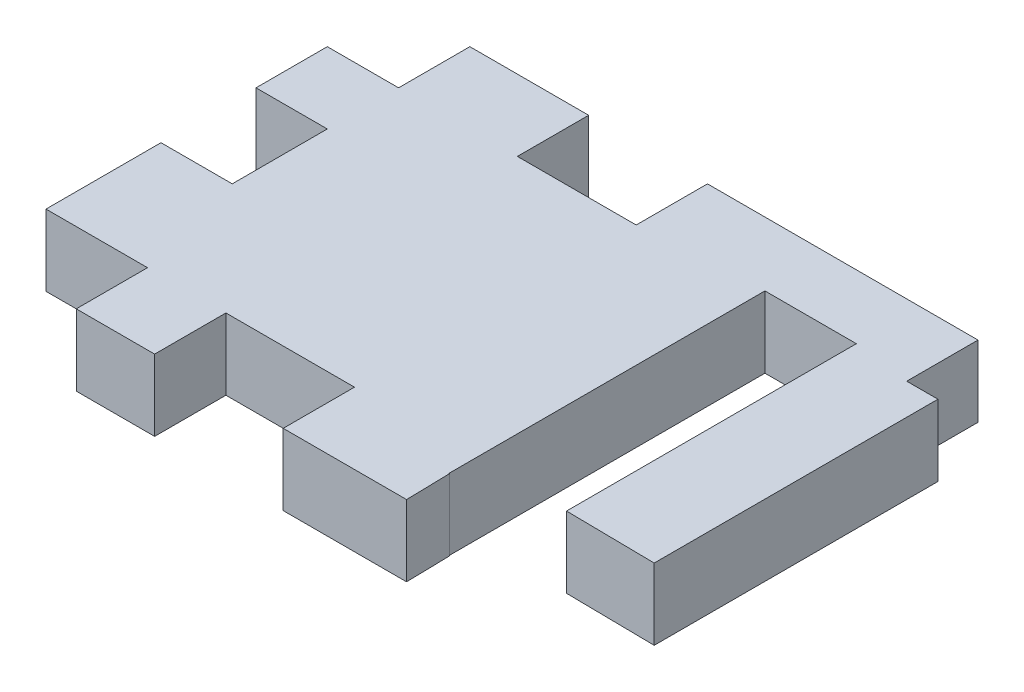
ISO-10303-21;
HEADER;
FILE_DESCRIPTION(('STEP AP214'),'2;1');
FILE_NAME('part.step','',(''),(''),'','','');
FILE_SCHEMA(('AUTOMOTIVE_DESIGN { 1 0 10303 214 1 1 1 1 }'));
ENDSEC;
DATA;
#1=APPLICATION_CONTEXT('core data for automotive mechanical design processes');
#2=APPLICATION_PROTOCOL_DEFINITION('international standard','automotive_design',2000,#1);
#3=PRODUCT_CONTEXT('',#1,'mechanical');
#4=PRODUCT('Part','Part','',(#3));
#5=PRODUCT_RELATED_PRODUCT_CATEGORY('part','',(#4));
#6=PRODUCT_DEFINITION_FORMATION('','',#4);
#7=PRODUCT_DEFINITION_CONTEXT('part definition',#1,'design');
#8=PRODUCT_DEFINITION('design','',#6,#7);
#9=PRODUCT_DEFINITION_SHAPE('','',#8);
#10=(LENGTH_UNIT() NAMED_UNIT(*) SI_UNIT(.MILLI.,.METRE.));
#11=(NAMED_UNIT(*) PLANE_ANGLE_UNIT() SI_UNIT($,.RADIAN.));
#12=(NAMED_UNIT(*) SI_UNIT($,.STERADIAN.) SOLID_ANGLE_UNIT());
#13=UNCERTAINTY_MEASURE_WITH_UNIT(LENGTH_MEASURE(1.E-05),#10,'distance_accuracy_value','');
#14=(GEOMETRIC_REPRESENTATION_CONTEXT(3) GLOBAL_UNCERTAINTY_ASSIGNED_CONTEXT((#13)) GLOBAL_UNIT_ASSIGNED_CONTEXT((#10,
#11,#12)) REPRESENTATION_CONTEXT('',''));
#15=CARTESIAN_POINT('',(0.,0.,0.));
#16=DIRECTION('',(0.,0.,1.));
#17=DIRECTION('',(1.,0.,0.));
#18=AXIS2_PLACEMENT_3D('',#15,#16,#17);
#19=CARTESIAN_POINT('',(0.,3.,0.));
#20=DIRECTION('',(1.,0.,0.));
#21=DIRECTION('',(0.,0.,-1.));
#22=AXIS2_PLACEMENT_3D('',#19,#20,#21);
#23=PLANE('',#22);
#24=DIRECTION('',(0.,0.,1.));
#25=VECTOR('',#24,1.);
#26=CARTESIAN_POINT('',(0.,0.,0.));
#27=LINE('',#26,#25);
#28=CARTESIAN_POINT('',(0.,0.,3.));
#29=VERTEX_POINT('',#28);
#30=CARTESIAN_POINT('',(0.,0.,6.));
#31=VERTEX_POINT('',#30);
#32=EDGE_CURVE('E335',#29,#31,#27,.T.);
#33=ORIENTED_EDGE('',*,*,#32,.T.);
#34=DIRECTION('',(0.,-1.,0.));
#35=VECTOR('',#34,1.);
#36=CARTESIAN_POINT('',(0.,3.,6.));
#37=LINE('',#36,#35);
#38=CARTESIAN_POINT('',(0.,3.,6.));
#39=VERTEX_POINT('',#38);
#40=EDGE_CURVE('E291',#39,#31,#37,.T.);
#41=ORIENTED_EDGE('',*,*,#40,.F.);
#42=DIRECTION('',(0.,0.,1.));
#43=VECTOR('',#42,1.);
#44=CARTESIAN_POINT('',(0.,3.,0.));
#45=LINE('',#44,#43);
#46=CARTESIAN_POINT('',(0.,3.,3.));
#47=VERTEX_POINT('',#46);
#48=EDGE_CURVE('E327',#47,#39,#45,.T.);
#49=ORIENTED_EDGE('',*,*,#48,.F.);
#50=DIRECTION('',(0.,-1.,0.));
#51=VECTOR('',#50,1.);
#52=CARTESIAN_POINT('',(0.,3.,3.));
#53=LINE('',#52,#51);
#54=EDGE_CURVE('E267',#47,#29,#53,.T.);
#55=ORIENTED_EDGE('',*,*,#54,.T.);
#56=EDGE_LOOP('',(#33,#41,#49,#55));
#57=FACE_BOUND('',#56,.T.);
#58=ADVANCED_FACE('F38',(#57),#23,.F.);
#59=CARTESIAN_POINT('',(0.,3.,0.));
#60=DIRECTION('',(0.,0.,1.));
#61=DIRECTION('',(1.,0.,0.));
#62=AXIS2_PLACEMENT_3D('',#59,#60,#61);
#63=PLANE('',#62);
#64=DIRECTION('',(-1.,0.,0.));
#65=VECTOR('',#64,1.);
#66=CARTESIAN_POINT('',(0.,3.,0.));
#67=LINE('',#66,#65);
#68=CARTESIAN_POINT('',(24.3862094533038,3.,0.));
#69=VERTEX_POINT('',#68);
#70=CARTESIAN_POINT('',(13.,3.,0.));
#71=VERTEX_POINT('',#70);
#72=EDGE_CURVE('E332',#69,#71,#67,.T.);
#73=ORIENTED_EDGE('',*,*,#72,.F.);
#74=DIRECTION('',(0.,-1.,0.));
#75=VECTOR('',#74,1.);
#76=CARTESIAN_POINT('',(24.3862094533038,3.,0.));
#77=LINE('',#76,#75);
#78=CARTESIAN_POINT('',(24.3862094533038,0.,0.));
#79=VERTEX_POINT('',#78);
#80=EDGE_CURVE('E229',#69,#79,#77,.T.);
#81=ORIENTED_EDGE('',*,*,#80,.T.);
#82=DIRECTION('',(-1.,0.,0.));
#83=VECTOR('',#82,1.);
#84=CARTESIAN_POINT('',(0.,0.,0.));
#85=LINE('',#84,#83);
#86=CARTESIAN_POINT('',(13.,0.,0.));
#87=VERTEX_POINT('',#86);
#88=EDGE_CURVE('E328',#79,#87,#85,.T.);
#89=ORIENTED_EDGE('',*,*,#88,.T.);
#90=DIRECTION('',(0.,-1.,0.));
#91=VECTOR('',#90,1.);
#92=CARTESIAN_POINT('',(13.,3.,0.));
#93=LINE('',#92,#91);
#94=EDGE_CURVE('E320',#71,#87,#93,.T.);
#95=ORIENTED_EDGE('',*,*,#94,.F.);
#96=EDGE_LOOP('',(#73,#81,#89,#95));
#97=FACE_BOUND('',#96,.T.);
#98=ADVANCED_FACE('F346',(#97),#63,.F.);
#99=CARTESIAN_POINT('',(8.00000000000001,0.,0.));
#100=VERTEX_POINT('',#99);
#101=CARTESIAN_POINT('',(3.,0.,0.));
#102=VERTEX_POINT('',#101);
#103=EDGE_CURVE('E336',#100,#102,#85,.T.);
#104=ORIENTED_EDGE('',*,*,#103,.T.);
#105=DIRECTION('',(0.,-1.,0.));
#106=VECTOR('',#105,1.);
#107=CARTESIAN_POINT('',(3.,3.,0.));
#108=LINE('',#107,#106);
#109=CARTESIAN_POINT('',(3.,3.,0.));
#110=VERTEX_POINT('',#109);
#111=EDGE_CURVE('E250',#110,#102,#108,.T.);
#112=ORIENTED_EDGE('',*,*,#111,.F.);
#113=CARTESIAN_POINT('',(8.00000000000001,3.,0.));
#114=VERTEX_POINT('',#113);
#115=EDGE_CURVE('E329',#114,#110,#67,.T.);
#116=ORIENTED_EDGE('',*,*,#115,.F.);
#117=DIRECTION('',(0.,-1.,0.));
#118=VECTOR('',#117,1.);
#119=CARTESIAN_POINT('',(8.00000000000001,3.,0.));
#120=LINE('',#119,#118);
#121=EDGE_CURVE('E308',#114,#100,#120,.T.);
#122=ORIENTED_EDGE('',*,*,#121,.T.);
#123=EDGE_LOOP('',(#104,#112,#116,#122));
#124=FACE_BOUND('',#123,.T.);
#125=ADVANCED_FACE('F366',(#124),#63,.F.);
#126=CARTESIAN_POINT('',(0.,0.,10.));
#127=VERTEX_POINT('',#126);
#128=CARTESIAN_POINT('',(0.,0.,14.8389895400953));
#129=VERTEX_POINT('',#128);
#130=EDGE_CURVE('E317',#127,#129,#27,.T.);
#131=ORIENTED_EDGE('',*,*,#130,.T.);
#132=DIRECTION('',(0.,1.,0.));
#133=VECTOR('',#132,1.);
#134=CARTESIAN_POINT('',(0.,3.,14.8389895400953));
#135=LINE('',#134,#133);
#136=CARTESIAN_POINT('',(0.,3.,14.8389895400953));
#137=VERTEX_POINT('',#136);
#138=EDGE_CURVE('E396',#129,#137,#135,.T.);
#139=ORIENTED_EDGE('',*,*,#138,.T.);
#140=CARTESIAN_POINT('',(0.,3.,10.));
#141=VERTEX_POINT('',#140);
#142=EDGE_CURVE('E324',#141,#137,#45,.T.);
#143=ORIENTED_EDGE('',*,*,#142,.F.);
#144=DIRECTION('',(0.,-1.,0.));
#145=VECTOR('',#144,1.);
#146=CARTESIAN_POINT('',(0.,3.,10.));
#147=LINE('',#146,#145);
#148=EDGE_CURVE('E293',#141,#127,#147,.T.);
#149=ORIENTED_EDGE('',*,*,#148,.T.);
#150=EDGE_LOOP('',(#131,#139,#143,#149));
#151=FACE_BOUND('',#150,.T.);
#152=ADVANCED_FACE('F40',(#151),#23,.F.);
#153=CARTESIAN_POINT('',(0.,3.,0.));
#154=DIRECTION('',(0.,1.,0.));
#155=DIRECTION('',(0.,0.,1.));
#156=AXIS2_PLACEMENT_3D('',#153,#154,#155);
#157=PLANE('',#156);
#158=DIRECTION('',(0.,0.,1.));
#159=VECTOR('',#158,1.);
#160=CARTESIAN_POINT('',(25.7,3.,0.));
#161=LINE('',#160,#159);
#162=CARTESIAN_POINT('',(25.7,3.,3.));
#163=VERTEX_POINT('',#162);
#164=CARTESIAN_POINT('',(25.7,3.,14.9417626814803));
#165=VERTEX_POINT('',#164);
#166=EDGE_CURVE('E53',#163,#165,#161,.T.);
#167=ORIENTED_EDGE('',*,*,#166,.F.);
#168=DIRECTION('',(-1.,0.,0.));
#169=VECTOR('',#168,1.);
#170=CARTESIAN_POINT('',(24.3862094533038,3.,3.));
#171=LINE('',#170,#169);
#172=CARTESIAN_POINT('',(24.3862094533038,3.,3.));
#173=VERTEX_POINT('',#172);
#174=EDGE_CURVE('E235',#163,#173,#171,.T.);
#175=ORIENTED_EDGE('',*,*,#174,.T.);
#176=DIRECTION('',(0.,0.,-1.));
#177=VECTOR('',#176,1.);
#178=CARTESIAN_POINT('',(24.3862094533038,3.,3.));
#179=LINE('',#178,#177);
#180=EDGE_CURVE('E240',#173,#69,#179,.T.);
#181=ORIENTED_EDGE('',*,*,#180,.T.);
#182=ORIENTED_EDGE('',*,*,#72,.T.);
#183=DIRECTION('',(0.,0.,1.));
#184=VECTOR('',#183,1.);
#185=CARTESIAN_POINT('',(13.,3.,3.));
#186=LINE('',#185,#184);
#187=CARTESIAN_POINT('',(13.,3.,3.));
#188=VERTEX_POINT('',#187);
#189=EDGE_CURVE('E301',#71,#188,#186,.T.);
#190=ORIENTED_EDGE('',*,*,#189,.T.);
#191=DIRECTION('',(-1.,0.,0.));
#192=VECTOR('',#191,1.);
#193=CARTESIAN_POINT('',(8.00000000000001,3.,3.));
#194=LINE('',#193,#192);
#195=CARTESIAN_POINT('',(8.00000000000001,3.,3.));
#196=VERTEX_POINT('',#195);
#197=EDGE_CURVE('E305',#188,#196,#194,.T.);
#198=ORIENTED_EDGE('',*,*,#197,.T.);
#199=DIRECTION('',(0.,0.,-1.));
#200=VECTOR('',#199,1.);
#201=CARTESIAN_POINT('',(8.00000000000001,3.,3.));
#202=LINE('',#201,#200);
#203=EDGE_CURVE('E298',#196,#114,#202,.T.);
#204=ORIENTED_EDGE('',*,*,#203,.T.);
#205=ORIENTED_EDGE('',*,*,#115,.T.);
#206=DIRECTION('',(0.,0.,1.));
#207=VECTOR('',#206,1.);
#208=CARTESIAN_POINT('',(3.,3.,0.));
#209=LINE('',#208,#207);
#210=CARTESIAN_POINT('',(3.,3.,3.));
#211=VERTEX_POINT('',#210);
#212=EDGE_CURVE('E254',#110,#211,#209,.T.);
#213=ORIENTED_EDGE('',*,*,#212,.T.);
#214=DIRECTION('',(-1.,0.,0.));
#215=VECTOR('',#214,1.);
#216=CARTESIAN_POINT('',(3.,3.,3.));
#217=LINE('',#216,#215);
#218=EDGE_CURVE('E257',#211,#47,#217,.T.);
#219=ORIENTED_EDGE('',*,*,#218,.T.);
#220=ORIENTED_EDGE('',*,*,#48,.T.);
#221=DIRECTION('',(1.,0.,0.));
#222=VECTOR('',#221,1.);
#223=CARTESIAN_POINT('',(3.,3.,6.));
#224=LINE('',#223,#222);
#225=CARTESIAN_POINT('',(3.,3.,6.));
#226=VERTEX_POINT('',#225);
#227=EDGE_CURVE('E279',#39,#226,#224,.T.);
#228=ORIENTED_EDGE('',*,*,#227,.T.);
#229=DIRECTION('',(0.,0.,1.));
#230=VECTOR('',#229,1.);
#231=CARTESIAN_POINT('',(3.,3.,10.));
#232=LINE('',#231,#230);
#233=CARTESIAN_POINT('',(3.,3.,10.));
#234=VERTEX_POINT('',#233);
#235=EDGE_CURVE('E272',#226,#234,#232,.T.);
#236=ORIENTED_EDGE('',*,*,#235,.T.);
#237=DIRECTION('',(-1.,0.,0.));
#238=VECTOR('',#237,1.);
#239=CARTESIAN_POINT('',(3.,3.,10.));
#240=LINE('',#239,#238);
#241=EDGE_CURVE('E275',#234,#141,#240,.T.);
#242=ORIENTED_EDGE('',*,*,#241,.T.);
#243=ORIENTED_EDGE('',*,*,#142,.T.);
#244=DIRECTION('',(1.,0.,0.));
#245=VECTOR('',#244,1.);
#246=CARTESIAN_POINT('',(-3.66256955739175,3.,14.8389895400953));
#247=LINE('',#246,#245);
#248=CARTESIAN_POINT('',(4.2732864480115,3.,14.8389895400953));
#249=VERTEX_POINT('',#248);
#250=EDGE_CURVE('E509',#137,#249,#247,.T.);
#251=ORIENTED_EDGE('',*,*,#250,.T.);
#252=DIRECTION('',(0.,0.,1.));
#253=VECTOR('',#252,1.);
#254=CARTESIAN_POINT('',(4.2732864480115,3.,14.8389895400953));
#255=LINE('',#254,#253);
#256=CARTESIAN_POINT('',(4.2732864480115,3.,17.8389895400953));
#257=VERTEX_POINT('',#256);
#258=EDGE_CURVE('E512',#249,#257,#255,.T.);
#259=ORIENTED_EDGE('',*,*,#258,.T.);
#260=DIRECTION('',(1.,0.,0.));
#261=VECTOR('',#260,1.);
#262=CARTESIAN_POINT('',(4.2732864480115,3.,17.8389895400953));
#263=LINE('',#262,#261);
#264=CARTESIAN_POINT('',(7.57204664219557,3.,17.8389895400953));
#265=VERTEX_POINT('',#264);
#266=EDGE_CURVE('E571',#257,#265,#263,.T.);
#267=ORIENTED_EDGE('',*,*,#266,.T.);
#268=DIRECTION('',(0.,0.,-1.));
#269=VECTOR('',#268,1.);
#270=CARTESIAN_POINT('',(7.57204664219557,3.,17.8389895400953));
#271=LINE('',#270,#269);
#272=CARTESIAN_POINT('',(7.57204664219557,3.,14.8389895400953));
#273=VERTEX_POINT('',#272);
#274=EDGE_CURVE('E568',#265,#273,#271,.T.);
#275=ORIENTED_EDGE('',*,*,#274,.T.);
#276=DIRECTION('',(1.,0.,0.));
#277=VECTOR('',#276,1.);
#278=CARTESIAN_POINT('',(7.57204664219557,3.,14.8389895400953));
#279=LINE('',#278,#277);
#280=CARTESIAN_POINT('',(12.9830971769778,3.,14.8389895400953));
#281=VERTEX_POINT('',#280);
#282=EDGE_CURVE('E564',#273,#281,#279,.T.);
#283=ORIENTED_EDGE('',*,*,#282,.T.);
#284=DIRECTION('',(0.,0.,1.));
#285=VECTOR('',#284,1.);
#286=CARTESIAN_POINT('',(12.9830971769778,3.,14.8389895400953));
#287=LINE('',#286,#285);
#288=CARTESIAN_POINT('',(12.9830971769778,3.,17.8389895400953));
#289=VERTEX_POINT('',#288);
#290=EDGE_CURVE('E563',#281,#289,#287,.T.);
#291=ORIENTED_EDGE('',*,*,#290,.T.);
#292=DIRECTION('',(1.,0.,0.));
#293=VECTOR('',#292,1.);
#294=CARTESIAN_POINT('',(12.9830971769778,3.,17.8389895400953));
#295=LINE('',#294,#293);
#296=CARTESIAN_POINT('',(18.1735498611886,3.,17.8389895400953));
#297=VERTEX_POINT('',#296);
#298=EDGE_CURVE('E535',#289,#297,#295,.T.);
#299=ORIENTED_EDGE('',*,*,#298,.T.);
#300=DIRECTION('',(-0.0206251895435776,0.,-0.999787278152854));
#301=VECTOR('',#300,1.);
#302=CARTESIAN_POINT('',(18.1735498611886,3.,17.8389895400953));
#303=LINE('',#302,#301);
#304=CARTESIAN_POINT('',(18.1353541631986,3.,15.9874878678394));
#305=VERTEX_POINT('',#304);
#306=EDGE_CURVE('E446',#297,#305,#303,.T.);
#307=ORIENTED_EDGE('',*,*,#306,.T.);
#308=DIRECTION('',(-1.,0.,0.));
#309=VECTOR('',#308,1.);
#310=CARTESIAN_POINT('',(21.9596428954265,3.,15.9874878678394));
#311=LINE('',#310,#309);
#312=CARTESIAN_POINT('',(18.1116611274721,3.,15.9874878678394));
#313=VERTEX_POINT('',#312);
#314=EDGE_CURVE('E411',#305,#313,#311,.T.);
#315=ORIENTED_EDGE('',*,*,#314,.T.);
#316=DIRECTION('',(0.,0.,-1.));
#317=VECTOR('',#316,1.);
#318=CARTESIAN_POINT('',(18.1116611274721,3.,2.69291195852617));
#319=LINE('',#318,#317);
#320=CARTESIAN_POINT('',(18.1116611274721,3.,2.69291195852617));
#321=VERTEX_POINT('',#320);
#322=EDGE_CURVE('E414',#313,#321,#319,.T.);
#323=ORIENTED_EDGE('',*,*,#322,.T.);
#324=DIRECTION('',(1.,0.,0.));
#325=VECTOR('',#324,1.);
#326=CARTESIAN_POINT('',(21.9596428954265,3.,2.69291195852617));
#327=LINE('',#326,#325);
#328=CARTESIAN_POINT('',(21.9596428954265,3.,2.69291195852617));
#329=VERTEX_POINT('',#328);
#330=EDGE_CURVE('E416',#321,#329,#327,.T.);
#331=ORIENTED_EDGE('',*,*,#330,.T.);
#332=DIRECTION('',(0.,0.,1.));
#333=VECTOR('',#332,1.);
#334=CARTESIAN_POINT('',(21.9596428954265,3.,2.69291195852617));
#335=LINE('',#334,#333);
#336=CARTESIAN_POINT('',(21.9596428954265,3.,14.8911049214624));
#337=VERTEX_POINT('',#336);
#338=EDGE_CURVE('E409',#329,#337,#335,.T.);
#339=ORIENTED_EDGE('',*,*,#338,.T.);
#340=DIRECTION('',(0.999908298573399,0.,0.0135423204824551));
#341=VECTOR('',#340,1.);
#342=CARTESIAN_POINT('',(18.1116611274721,3.,14.8389895400953));
#343=LINE('',#342,#341);
#344=EDGE_CURVE('E59',#337,#165,#343,.T.);
#345=ORIENTED_EDGE('',*,*,#344,.T.);
#346=EDGE_LOOP('',(#167,#175,#181,#182,#190,#198,#204,#205,#213,#219,#220,#228,#236,#242,#243,
#251,#259,#267,#275,#283,#291,#299,#307,#315,#323,#331,#339,#345));
#347=FACE_BOUND('',#346,.T.);
#348=ADVANCED_FACE('F233',(#347),#157,.T.);
#349=CARTESIAN_POINT('',(0.,0.,0.));
#350=DIRECTION('',(0.,1.,0.));
#351=DIRECTION('',(0.,0.,1.));
#352=AXIS2_PLACEMENT_3D('',#349,#350,#351);
#353=PLANE('',#352);
#354=DIRECTION('',(-1.,0.,0.));
#355=VECTOR('',#354,1.);
#356=CARTESIAN_POINT('',(24.3862094533038,0.,3.));
#357=LINE('',#356,#355);
#358=CARTESIAN_POINT('',(25.7,0.,3.));
#359=VERTEX_POINT('',#358);
#360=CARTESIAN_POINT('',(24.3862094533038,0.,3.));
#361=VERTEX_POINT('',#360);
#362=EDGE_CURVE('E244',#359,#361,#357,.T.);
#363=ORIENTED_EDGE('',*,*,#362,.F.);
#364=DIRECTION('',(0.,0.,1.));
#365=VECTOR('',#364,1.);
#366=CARTESIAN_POINT('',(25.7,0.,0.));
#367=LINE('',#366,#365);
#368=CARTESIAN_POINT('',(25.7,0.,14.9417626814803));
#369=VERTEX_POINT('',#368);
#370=EDGE_CURVE('E223',#359,#369,#367,.T.);
#371=ORIENTED_EDGE('',*,*,#370,.T.);
#372=DIRECTION('',(0.999908298573399,0.,0.0135423204824551));
#373=VECTOR('',#372,1.);
#374=CARTESIAN_POINT('',(18.1116611274721,0.,14.8389895400953));
#375=LINE('',#374,#373);
#376=CARTESIAN_POINT('',(21.9596428954265,0.,14.8911049214624));
#377=VERTEX_POINT('',#376);
#378=EDGE_CURVE('E508',#377,#369,#375,.T.);
#379=ORIENTED_EDGE('',*,*,#378,.F.);
#380=DIRECTION('',(0.,0.,1.));
#381=VECTOR('',#380,1.);
#382=CARTESIAN_POINT('',(21.9596428954265,0.,2.69291195852617));
#383=LINE('',#382,#381);
#384=CARTESIAN_POINT('',(21.9596428954265,0.,2.69291195852617));
#385=VERTEX_POINT('',#384);
#386=EDGE_CURVE('E399',#385,#377,#383,.T.);
#387=ORIENTED_EDGE('',*,*,#386,.F.);
#388=DIRECTION('',(1.,0.,0.));
#389=VECTOR('',#388,1.);
#390=CARTESIAN_POINT('',(21.9596428954265,0.,2.69291195852617));
#391=LINE('',#390,#389);
#392=CARTESIAN_POINT('',(18.1116611274721,0.,2.69291195852617));
#393=VERTEX_POINT('',#392);
#394=EDGE_CURVE('E412',#393,#385,#391,.T.);
#395=ORIENTED_EDGE('',*,*,#394,.F.);
#396=DIRECTION('',(0.,0.,-1.));
#397=VECTOR('',#396,1.);
#398=CARTESIAN_POINT('',(18.1116611274721,0.,2.69291195852617));
#399=LINE('',#398,#397);
#400=CARTESIAN_POINT('',(18.1116611274721,0.,15.9874878678394));
#401=VERTEX_POINT('',#400);
#402=EDGE_CURVE('E421',#401,#393,#399,.T.);
#403=ORIENTED_EDGE('',*,*,#402,.F.);
#404=DIRECTION('',(-1.,0.,0.));
#405=VECTOR('',#404,1.);
#406=CARTESIAN_POINT('',(21.9596428954265,0.,15.9874878678394));
#407=LINE('',#406,#405);
#408=CARTESIAN_POINT('',(18.1353541631986,0.,15.9874878678394));
#409=VERTEX_POINT('',#408);
#410=EDGE_CURVE('E403',#409,#401,#407,.T.);
#411=ORIENTED_EDGE('',*,*,#410,.F.);
#412=DIRECTION('',(-0.0206251895435776,0.,-0.999787278152854));
#413=VECTOR('',#412,1.);
#414=CARTESIAN_POINT('',(18.1735498611886,0.,17.8389895400953));
#415=LINE('',#414,#413);
#416=CARTESIAN_POINT('',(18.1735498611886,0.,17.8389895400953));
#417=VERTEX_POINT('',#416);
#418=EDGE_CURVE('E510',#417,#409,#415,.T.);
#419=ORIENTED_EDGE('',*,*,#418,.F.);
#420=DIRECTION('',(1.,0.,0.));
#421=VECTOR('',#420,1.);
#422=CARTESIAN_POINT('',(12.9830971769778,0.,17.8389895400953));
#423=LINE('',#422,#421);
#424=CARTESIAN_POINT('',(12.9830971769778,0.,17.8389895400953));
#425=VERTEX_POINT('',#424);
#426=EDGE_CURVE('E514',#425,#417,#423,.T.);
#427=ORIENTED_EDGE('',*,*,#426,.F.);
#428=DIRECTION('',(0.,0.,1.));
#429=VECTOR('',#428,1.);
#430=CARTESIAN_POINT('',(12.9830971769778,0.,14.8389895400953));
#431=LINE('',#430,#429);
#432=CARTESIAN_POINT('',(12.9830971769778,0.,14.8389895400953));
#433=VERTEX_POINT('',#432);
#434=EDGE_CURVE('E552',#433,#425,#431,.T.);
#435=ORIENTED_EDGE('',*,*,#434,.F.);
#436=DIRECTION('',(1.,0.,0.));
#437=VECTOR('',#436,1.);
#438=CARTESIAN_POINT('',(7.57204664219557,0.,14.8389895400953));
#439=LINE('',#438,#437);
#440=CARTESIAN_POINT('',(7.57204664219557,0.,14.8389895400953));
#441=VERTEX_POINT('',#440);
#442=EDGE_CURVE('E549',#441,#433,#439,.T.);
#443=ORIENTED_EDGE('',*,*,#442,.F.);
#444=DIRECTION('',(0.,0.,-1.));
#445=VECTOR('',#444,1.);
#446=CARTESIAN_POINT('',(7.57204664219557,0.,17.8389895400953));
#447=LINE('',#446,#445);
#448=CARTESIAN_POINT('',(7.57204664219557,0.,17.8389895400953));
#449=VERTEX_POINT('',#448);
#450=EDGE_CURVE('E546',#449,#441,#447,.T.);
#451=ORIENTED_EDGE('',*,*,#450,.F.);
#452=DIRECTION('',(1.,0.,0.));
#453=VECTOR('',#452,1.);
#454=CARTESIAN_POINT('',(4.2732864480115,0.,17.8389895400953));
#455=LINE('',#454,#453);
#456=CARTESIAN_POINT('',(4.2732864480115,0.,17.8389895400953));
#457=VERTEX_POINT('',#456);
#458=EDGE_CURVE('E543',#457,#449,#455,.T.);
#459=ORIENTED_EDGE('',*,*,#458,.F.);
#460=DIRECTION('',(0.,0.,1.));
#461=VECTOR('',#460,1.);
#462=CARTESIAN_POINT('',(4.2732864480115,0.,14.8389895400953));
#463=LINE('',#462,#461);
#464=CARTESIAN_POINT('',(4.2732864480115,0.,14.8389895400953));
#465=VERTEX_POINT('',#464);
#466=EDGE_CURVE('E541',#465,#457,#463,.T.);
#467=ORIENTED_EDGE('',*,*,#466,.F.);
#468=DIRECTION('',(1.,0.,0.));
#469=VECTOR('',#468,1.);
#470=CARTESIAN_POINT('',(0.,0.,14.8389895400953));
#471=LINE('',#470,#469);
#472=EDGE_CURVE('E539',#129,#465,#471,.T.);
#473=ORIENTED_EDGE('',*,*,#472,.F.);
#474=ORIENTED_EDGE('',*,*,#130,.F.);
#475=DIRECTION('',(-1.,0.,0.));
#476=VECTOR('',#475,1.);
#477=CARTESIAN_POINT('',(3.,0.,10.));
#478=LINE('',#477,#476);
#479=CARTESIAN_POINT('',(3.,0.,10.));
#480=VERTEX_POINT('',#479);
#481=EDGE_CURVE('E285',#480,#127,#478,.T.);
#482=ORIENTED_EDGE('',*,*,#481,.F.);
#483=DIRECTION('',(0.,0.,1.));
#484=VECTOR('',#483,1.);
#485=CARTESIAN_POINT('',(3.,0.,10.));
#486=LINE('',#485,#484);
#487=CARTESIAN_POINT('',(3.,0.,6.));
#488=VERTEX_POINT('',#487);
#489=EDGE_CURVE('E283',#488,#480,#486,.T.);
#490=ORIENTED_EDGE('',*,*,#489,.F.);
#491=DIRECTION('',(1.,0.,0.));
#492=VECTOR('',#491,1.);
#493=CARTESIAN_POINT('',(3.,0.,6.));
#494=LINE('',#493,#492);
#495=EDGE_CURVE('E276',#31,#488,#494,.T.);
#496=ORIENTED_EDGE('',*,*,#495,.F.);
#497=ORIENTED_EDGE('',*,*,#32,.F.);
#498=DIRECTION('',(-1.,0.,0.));
#499=VECTOR('',#498,1.);
#500=CARTESIAN_POINT('',(3.,0.,3.));
#501=LINE('',#500,#499);
#502=CARTESIAN_POINT('',(3.,0.,3.));
#503=VERTEX_POINT('',#502);
#504=EDGE_CURVE('E258',#503,#29,#501,.T.);
#505=ORIENTED_EDGE('',*,*,#504,.F.);
#506=DIRECTION('',(0.,0.,1.));
#507=VECTOR('',#506,1.);
#508=CARTESIAN_POINT('',(3.,0.,0.));
#509=LINE('',#508,#507);
#510=EDGE_CURVE('E262',#102,#503,#509,.T.);
#511=ORIENTED_EDGE('',*,*,#510,.F.);
#512=ORIENTED_EDGE('',*,*,#103,.F.);
#513=DIRECTION('',(0.,0.,-1.));
#514=VECTOR('',#513,1.);
#515=CARTESIAN_POINT('',(8.00000000000001,0.,3.));
#516=LINE('',#515,#514);
#517=CARTESIAN_POINT('',(8.00000000000001,0.,3.));
#518=VERTEX_POINT('',#517);
#519=EDGE_CURVE('E252',#518,#100,#516,.T.);
#520=ORIENTED_EDGE('',*,*,#519,.F.);
#521=DIRECTION('',(-1.,0.,0.));
#522=VECTOR('',#521,1.);
#523=CARTESIAN_POINT('',(8.00000000000001,0.,3.));
#524=LINE('',#523,#522);
#525=CARTESIAN_POINT('',(13.,0.,3.));
#526=VERTEX_POINT('',#525);
#527=EDGE_CURVE('E302',#526,#518,#524,.T.);
#528=ORIENTED_EDGE('',*,*,#527,.F.);
#529=DIRECTION('',(0.,0.,1.));
#530=VECTOR('',#529,1.);
#531=CARTESIAN_POINT('',(13.,0.,3.));
#532=LINE('',#531,#530);
#533=EDGE_CURVE('E310',#87,#526,#532,.T.);
#534=ORIENTED_EDGE('',*,*,#533,.F.);
#535=ORIENTED_EDGE('',*,*,#88,.F.);
#536=DIRECTION('',(0.,0.,-1.));
#537=VECTOR('',#536,1.);
#538=CARTESIAN_POINT('',(24.3862094533038,0.,3.));
#539=LINE('',#538,#537);
#540=EDGE_CURVE('E248',#361,#79,#539,.T.);
#541=ORIENTED_EDGE('',*,*,#540,.F.);
#542=EDGE_LOOP('',(#363,#371,#379,#387,#395,#403,#411,#419,#427,#435,#443,#451,#459,#467,#473,
#474,#482,#490,#496,#497,#505,#511,#512,#520,#528,#534,#535,#541));
#543=FACE_BOUND('',#542,.T.);
#544=ADVANCED_FACE('F354',(#543),#353,.F.);
#545=CARTESIAN_POINT('',(8.00000000000001,3.,3.));
#546=DIRECTION('',(-1.,0.,0.));
#547=DIRECTION('',(0.,0.,1.));
#548=AXIS2_PLACEMENT_3D('',#545,#546,#547);
#549=PLANE('',#548);
#550=ORIENTED_EDGE('',*,*,#519,.T.);
#551=ORIENTED_EDGE('',*,*,#121,.F.);
#552=ORIENTED_EDGE('',*,*,#203,.F.);
#553=DIRECTION('',(0.,-1.,0.));
#554=VECTOR('',#553,1.);
#555=CARTESIAN_POINT('',(8.00000000000001,3.,3.));
#556=LINE('',#555,#554);
#557=EDGE_CURVE('E315',#196,#518,#556,.T.);
#558=ORIENTED_EDGE('',*,*,#557,.T.);
#559=EDGE_LOOP('',(#550,#551,#552,#558));
#560=FACE_BOUND('',#559,.T.);
#561=ADVANCED_FACE('F477',(#560),#549,.F.);
#562=CARTESIAN_POINT('',(8.00000000000001,3.,3.));
#563=DIRECTION('',(0.,0.,1.));
#564=DIRECTION('',(1.,0.,0.));
#565=AXIS2_PLACEMENT_3D('',#562,#563,#564);
#566=PLANE('',#565);
#567=ORIENTED_EDGE('',*,*,#527,.T.);
#568=ORIENTED_EDGE('',*,*,#557,.F.);
#569=ORIENTED_EDGE('',*,*,#197,.F.);
#570=DIRECTION('',(0.,-1.,0.));
#571=VECTOR('',#570,1.);
#572=CARTESIAN_POINT('',(13.,3.,3.));
#573=LINE('',#572,#571);
#574=EDGE_CURVE('E318',#188,#526,#573,.T.);
#575=ORIENTED_EDGE('',*,*,#574,.T.);
#576=EDGE_LOOP('',(#567,#568,#569,#575));
#577=FACE_BOUND('',#576,.T.);
#578=ADVANCED_FACE('F359',(#577),#566,.F.);
#579=CARTESIAN_POINT('',(13.,3.,3.));
#580=DIRECTION('',(1.,0.,0.));
#581=DIRECTION('',(0.,0.,-1.));
#582=AXIS2_PLACEMENT_3D('',#579,#580,#581);
#583=PLANE('',#582);
#584=ORIENTED_EDGE('',*,*,#533,.T.);
#585=ORIENTED_EDGE('',*,*,#574,.F.);
#586=ORIENTED_EDGE('',*,*,#189,.F.);
#587=ORIENTED_EDGE('',*,*,#94,.T.);
#588=EDGE_LOOP('',(#584,#585,#586,#587));
#589=FACE_BOUND('',#588,.T.);
#590=ADVANCED_FACE('F351',(#589),#583,.F.);
#591=CARTESIAN_POINT('',(24.3862094533038,3.,3.));
#592=DIRECTION('',(-1.,0.,0.));
#593=DIRECTION('',(0.,0.,1.));
#594=AXIS2_PLACEMENT_3D('',#591,#592,#593);
#595=PLANE('',#594);
#596=ORIENTED_EDGE('',*,*,#540,.T.);
#597=ORIENTED_EDGE('',*,*,#80,.F.);
#598=ORIENTED_EDGE('',*,*,#180,.F.);
#599=DIRECTION('',(0.,-1.,0.));
#600=VECTOR('',#599,1.);
#601=CARTESIAN_POINT('',(24.3862094533038,3.,3.));
#602=LINE('',#601,#600);
#603=EDGE_CURVE('E228',#173,#361,#602,.T.);
#604=ORIENTED_EDGE('',*,*,#603,.T.);
#605=EDGE_LOOP('',(#596,#597,#598,#604));
#606=FACE_BOUND('',#605,.T.);
#607=ADVANCED_FACE('F483',(#606),#595,.F.);
#608=CARTESIAN_POINT('',(24.3862094533038,3.,3.));
#609=DIRECTION('',(0.,0.,1.));
#610=DIRECTION('',(1.,0.,0.));
#611=AXIS2_PLACEMENT_3D('',#608,#609,#610);
#612=PLANE('',#611);
#613=ORIENTED_EDGE('',*,*,#362,.T.);
#614=ORIENTED_EDGE('',*,*,#603,.F.);
#615=ORIENTED_EDGE('',*,*,#174,.F.);
#616=DIRECTION('',(0.,-1.,0.));
#617=VECTOR('',#616,1.);
#618=CARTESIAN_POINT('',(25.7,3.,3.));
#619=LINE('',#618,#617);
#620=EDGE_CURVE('E220',#163,#359,#619,.T.);
#621=ORIENTED_EDGE('',*,*,#620,.T.);
#622=EDGE_LOOP('',(#613,#614,#615,#621));
#623=FACE_BOUND('',#622,.T.);
#624=ADVANCED_FACE('F238',(#623),#612,.F.);
#625=CARTESIAN_POINT('',(3.,3.,0.));
#626=DIRECTION('',(1.,0.,0.));
#627=DIRECTION('',(0.,0.,-1.));
#628=AXIS2_PLACEMENT_3D('',#625,#626,#627);
#629=PLANE('',#628);
#630=ORIENTED_EDGE('',*,*,#510,.T.);
#631=DIRECTION('',(0.,-1.,0.));
#632=VECTOR('',#631,1.);
#633=CARTESIAN_POINT('',(3.,3.,3.));
#634=LINE('',#633,#632);
#635=EDGE_CURVE('E261',#211,#503,#634,.T.);
#636=ORIENTED_EDGE('',*,*,#635,.F.);
#637=ORIENTED_EDGE('',*,*,#212,.F.);
#638=ORIENTED_EDGE('',*,*,#111,.T.);
#639=EDGE_LOOP('',(#630,#636,#637,#638));
#640=FACE_BOUND('',#639,.T.);
#641=ADVANCED_FACE('F369',(#640),#629,.F.);
#642=CARTESIAN_POINT('',(3.,3.,3.));
#643=DIRECTION('',(0.,0.,1.));
#644=DIRECTION('',(1.,0.,0.));
#645=AXIS2_PLACEMENT_3D('',#642,#643,#644);
#646=PLANE('',#645);
#647=ORIENTED_EDGE('',*,*,#504,.T.);
#648=ORIENTED_EDGE('',*,*,#54,.F.);
#649=ORIENTED_EDGE('',*,*,#218,.F.);
#650=ORIENTED_EDGE('',*,*,#635,.T.);
#651=EDGE_LOOP('',(#647,#648,#649,#650));
#652=FACE_BOUND('',#651,.T.);
#653=ADVANCED_FACE('F375',(#652),#646,.F.);
#654=CARTESIAN_POINT('',(3.,3.,10.));
#655=DIRECTION('',(1.,0.,0.));
#656=DIRECTION('',(0.,0.,-1.));
#657=AXIS2_PLACEMENT_3D('',#654,#655,#656);
#658=PLANE('',#657);
#659=ORIENTED_EDGE('',*,*,#489,.T.);
#660=DIRECTION('',(0.,-1.,0.));
#661=VECTOR('',#660,1.);
#662=CARTESIAN_POINT('',(3.,3.,10.));
#663=LINE('',#662,#661);
#664=EDGE_CURVE('E282',#234,#480,#663,.T.);
#665=ORIENTED_EDGE('',*,*,#664,.F.);
#666=ORIENTED_EDGE('',*,*,#235,.F.);
#667=DIRECTION('',(0.,-1.,0.));
#668=VECTOR('',#667,1.);
#669=CARTESIAN_POINT('',(3.,3.,6.));
#670=LINE('',#669,#668);
#671=EDGE_CURVE('E264',#226,#488,#670,.T.);
#672=ORIENTED_EDGE('',*,*,#671,.T.);
#673=EDGE_LOOP('',(#659,#665,#666,#672));
#674=FACE_BOUND('',#673,.T.);
#675=ADVANCED_FACE('F386',(#674),#658,.F.);
#676=CARTESIAN_POINT('',(3.,3.,6.));
#677=DIRECTION('',(0.,0.,-1.));
#678=DIRECTION('',(-1.,0.,0.));
#679=AXIS2_PLACEMENT_3D('',#676,#677,#678);
#680=PLANE('',#679);
#681=ORIENTED_EDGE('',*,*,#495,.T.);
#682=ORIENTED_EDGE('',*,*,#671,.F.);
#683=ORIENTED_EDGE('',*,*,#227,.F.);
#684=ORIENTED_EDGE('',*,*,#40,.T.);
#685=EDGE_LOOP('',(#681,#682,#683,#684));
#686=FACE_BOUND('',#685,.T.);
#687=ADVANCED_FACE('F383',(#686),#680,.F.);
#688=CARTESIAN_POINT('',(3.,3.,10.));
#689=DIRECTION('',(0.,0.,1.));
#690=DIRECTION('',(1.,0.,0.));
#691=AXIS2_PLACEMENT_3D('',#688,#689,#690);
#692=PLANE('',#691);
#693=ORIENTED_EDGE('',*,*,#481,.T.);
#694=ORIENTED_EDGE('',*,*,#148,.F.);
#695=ORIENTED_EDGE('',*,*,#241,.F.);
#696=ORIENTED_EDGE('',*,*,#664,.T.);
#697=EDGE_LOOP('',(#693,#694,#695,#696));
#698=FACE_BOUND('',#697,.T.);
#699=ADVANCED_FACE('F390',(#698),#692,.F.);
#700=CARTESIAN_POINT('',(21.9596428954265,3.,2.69291195852617));
#701=DIRECTION('',(1.,0.,0.));
#702=DIRECTION('',(0.,0.,-1.));
#703=AXIS2_PLACEMENT_3D('',#700,#701,#702);
#704=PLANE('',#703);
#705=ORIENTED_EDGE('',*,*,#386,.T.);
#706=DIRECTION('',(0.,1.,0.));
#707=VECTOR('',#706,1.);
#708=CARTESIAN_POINT('',(21.9596428954265,3.,14.8911049214624));
#709=LINE('',#708,#707);
#710=EDGE_CURVE('E400',#377,#337,#709,.T.);
#711=ORIENTED_EDGE('',*,*,#710,.T.);
#712=ORIENTED_EDGE('',*,*,#338,.F.);
#713=DIRECTION('',(0.,-1.,0.));
#714=VECTOR('',#713,1.);
#715=CARTESIAN_POINT('',(21.9596428954265,3.,2.69291195852617));
#716=LINE('',#715,#714);
#717=EDGE_CURVE('E286',#329,#385,#716,.T.);
#718=ORIENTED_EDGE('',*,*,#717,.T.);
#719=EDGE_LOOP('',(#705,#711,#712,#718));
#720=FACE_BOUND('',#719,.T.);
#721=ADVANCED_FACE('F490',(#720),#704,.F.);
#722=CARTESIAN_POINT('',(21.9596428954265,3.,2.69291195852617));
#723=DIRECTION('',(0.,0.,-1.));
#724=DIRECTION('',(-1.,0.,0.));
#725=AXIS2_PLACEMENT_3D('',#722,#723,#724);
#726=PLANE('',#725);
#727=ORIENTED_EDGE('',*,*,#394,.T.);
#728=ORIENTED_EDGE('',*,*,#717,.F.);
#729=ORIENTED_EDGE('',*,*,#330,.F.);
#730=DIRECTION('',(0.,-1.,0.));
#731=VECTOR('',#730,1.);
#732=CARTESIAN_POINT('',(18.1116611274721,3.,2.69291195852617));
#733=LINE('',#732,#731);
#734=EDGE_CURVE('E426',#321,#393,#733,.T.);
#735=ORIENTED_EDGE('',*,*,#734,.T.);
#736=EDGE_LOOP('',(#727,#728,#729,#735));
#737=FACE_BOUND('',#736,.T.);
#738=ADVANCED_FACE('F440',(#737),#726,.F.);
#739=CARTESIAN_POINT('',(18.1116611274721,3.,2.69291195852617));
#740=DIRECTION('',(-1.,0.,0.));
#741=DIRECTION('',(0.,0.,1.));
#742=AXIS2_PLACEMENT_3D('',#739,#740,#741);
#743=PLANE('',#742);
#744=ORIENTED_EDGE('',*,*,#402,.T.);
#745=ORIENTED_EDGE('',*,*,#734,.F.);
#746=ORIENTED_EDGE('',*,*,#322,.F.);
#747=DIRECTION('',(0.,-1.,0.));
#748=VECTOR('',#747,1.);
#749=CARTESIAN_POINT('',(18.1116611274721,3.,15.9874878678394));
#750=LINE('',#749,#748);
#751=EDGE_CURVE('E418',#313,#401,#750,.T.);
#752=ORIENTED_EDGE('',*,*,#751,.T.);
#753=EDGE_LOOP('',(#744,#745,#746,#752));
#754=FACE_BOUND('',#753,.T.);
#755=ADVANCED_FACE('F433',(#754),#743,.F.);
#756=CARTESIAN_POINT('',(21.9596428954265,3.,15.9874878678394));
#757=DIRECTION('',(0.,0.,1.));
#758=DIRECTION('',(1.,0.,0.));
#759=AXIS2_PLACEMENT_3D('',#756,#757,#758);
#760=PLANE('',#759);
#761=ORIENTED_EDGE('',*,*,#314,.F.);
#762=DIRECTION('',(0.,-1.,0.));
#763=VECTOR('',#762,1.);
#764=CARTESIAN_POINT('',(18.1353541631986,3.,15.9874878678394));
#765=LINE('',#764,#763);
#766=EDGE_CURVE('E46',#305,#409,#765,.T.);
#767=ORIENTED_EDGE('',*,*,#766,.T.);
#768=ORIENTED_EDGE('',*,*,#410,.T.);
#769=ORIENTED_EDGE('',*,*,#751,.F.);
#770=EDGE_LOOP('',(#761,#767,#768,#769));
#771=FACE_BOUND('',#770,.T.);
#772=ADVANCED_FACE('F447',(#771),#760,.F.);
#773=CARTESIAN_POINT('',(18.1735498611886,3.,17.8389895400953));
#774=DIRECTION('',(-0.999787278152854,0.,0.0206251895435776));
#775=DIRECTION('',(0.0206251895435776,0.,0.999787278152854));
#776=AXIS2_PLACEMENT_3D('',#773,#774,#775);
#777=PLANE('',#776);
#778=ORIENTED_EDGE('',*,*,#306,.F.);
#779=DIRECTION('',(0.,-1.,0.));
#780=VECTOR('',#779,1.);
#781=CARTESIAN_POINT('',(18.1735498611886,3.,17.8389895400953));
#782=LINE('',#781,#780);
#783=EDGE_CURVE('E405',#297,#417,#782,.T.);
#784=ORIENTED_EDGE('',*,*,#783,.T.);
#785=ORIENTED_EDGE('',*,*,#418,.T.);
#786=ORIENTED_EDGE('',*,*,#766,.F.);
#787=EDGE_LOOP('',(#778,#784,#785,#786));
#788=FACE_BOUND('',#787,.T.);
#789=ADVANCED_FACE('F449',(#788),#777,.F.);
#790=CARTESIAN_POINT('',(0.,3.,14.8389895400953));
#791=DIRECTION('',(0.,0.,-1.));
#792=DIRECTION('',(-1.,0.,0.));
#793=AXIS2_PLACEMENT_3D('',#790,#791,#792);
#794=PLANE('',#793);
#795=ORIENTED_EDGE('',*,*,#472,.T.);
#796=DIRECTION('',(0.,-1.,0.));
#797=VECTOR('',#796,1.);
#798=CARTESIAN_POINT('',(4.2732864480115,3.,14.8389895400953));
#799=LINE('',#798,#797);
#800=EDGE_CURVE('E528',#249,#465,#799,.T.);
#801=ORIENTED_EDGE('',*,*,#800,.F.);
#802=ORIENTED_EDGE('',*,*,#250,.F.);
#803=ORIENTED_EDGE('',*,*,#138,.F.);
#804=EDGE_LOOP('',(#795,#801,#802,#803));
#805=FACE_BOUND('',#804,.T.);
#806=ADVANCED_FACE('F455',(#805),#794,.F.);
#807=CARTESIAN_POINT('',(4.2732864480115,3.,14.8389895400953));
#808=DIRECTION('',(1.,0.,0.));
#809=DIRECTION('',(0.,0.,-1.));
#810=AXIS2_PLACEMENT_3D('',#807,#808,#809);
#811=PLANE('',#810);
#812=ORIENTED_EDGE('',*,*,#466,.T.);
#813=DIRECTION('',(0.,-1.,0.));
#814=VECTOR('',#813,1.);
#815=CARTESIAN_POINT('',(4.2732864480115,3.,17.8389895400953));
#816=LINE('',#815,#814);
#817=EDGE_CURVE('E527',#257,#457,#816,.T.);
#818=ORIENTED_EDGE('',*,*,#817,.F.);
#819=ORIENTED_EDGE('',*,*,#258,.F.);
#820=ORIENTED_EDGE('',*,*,#800,.T.);
#821=EDGE_LOOP('',(#812,#818,#819,#820));
#822=FACE_BOUND('',#821,.T.);
#823=ADVANCED_FACE('F577',(#822),#811,.F.);
#824=CARTESIAN_POINT('',(4.2732864480115,3.,17.8389895400953));
#825=DIRECTION('',(0.,0.,-1.));
#826=DIRECTION('',(-1.,0.,0.));
#827=AXIS2_PLACEMENT_3D('',#824,#825,#826);
#828=PLANE('',#827);
#829=ORIENTED_EDGE('',*,*,#458,.T.);
#830=DIRECTION('',(0.,-1.,0.));
#831=VECTOR('',#830,1.);
#832=CARTESIAN_POINT('',(7.57204664219557,3.,17.8389895400953));
#833=LINE('',#832,#831);
#834=EDGE_CURVE('E525',#265,#449,#833,.T.);
#835=ORIENTED_EDGE('',*,*,#834,.F.);
#836=ORIENTED_EDGE('',*,*,#266,.F.);
#837=ORIENTED_EDGE('',*,*,#817,.T.);
#838=EDGE_LOOP('',(#829,#835,#836,#837));
#839=FACE_BOUND('',#838,.T.);
#840=ADVANCED_FACE('F580',(#839),#828,.F.);
#841=CARTESIAN_POINT('',(7.57204664219557,3.,17.8389895400953));
#842=DIRECTION('',(-1.,0.,0.));
#843=DIRECTION('',(0.,0.,1.));
#844=AXIS2_PLACEMENT_3D('',#841,#842,#843);
#845=PLANE('',#844);
#846=ORIENTED_EDGE('',*,*,#450,.T.);
#847=DIRECTION('',(0.,-1.,0.));
#848=VECTOR('',#847,1.);
#849=CARTESIAN_POINT('',(7.57204664219557,3.,14.8389895400953));
#850=LINE('',#849,#848);
#851=EDGE_CURVE('E523',#273,#441,#850,.T.);
#852=ORIENTED_EDGE('',*,*,#851,.F.);
#853=ORIENTED_EDGE('',*,*,#274,.F.);
#854=ORIENTED_EDGE('',*,*,#834,.T.);
#855=EDGE_LOOP('',(#846,#852,#853,#854));
#856=FACE_BOUND('',#855,.T.);
#857=ADVANCED_FACE('F584',(#856),#845,.F.);
#858=CARTESIAN_POINT('',(7.57204664219557,3.,14.8389895400953));
#859=DIRECTION('',(0.,0.,-1.));
#860=DIRECTION('',(-1.,0.,0.));
#861=AXIS2_PLACEMENT_3D('',#858,#859,#860);
#862=PLANE('',#861);
#863=ORIENTED_EDGE('',*,*,#442,.T.);
#864=DIRECTION('',(0.,-1.,0.));
#865=VECTOR('',#864,1.);
#866=CARTESIAN_POINT('',(12.9830971769778,3.,14.8389895400953));
#867=LINE('',#866,#865);
#868=EDGE_CURVE('E521',#281,#433,#867,.T.);
#869=ORIENTED_EDGE('',*,*,#868,.F.);
#870=ORIENTED_EDGE('',*,*,#282,.F.);
#871=ORIENTED_EDGE('',*,*,#851,.T.);
#872=EDGE_LOOP('',(#863,#869,#870,#871));
#873=FACE_BOUND('',#872,.T.);
#874=ADVANCED_FACE('F587',(#873),#862,.F.);
#875=CARTESIAN_POINT('',(12.9830971769778,3.,14.8389895400953));
#876=DIRECTION('',(1.,0.,0.));
#877=DIRECTION('',(0.,0.,-1.));
#878=AXIS2_PLACEMENT_3D('',#875,#876,#877);
#879=PLANE('',#878);
#880=ORIENTED_EDGE('',*,*,#434,.T.);
#881=DIRECTION('',(0.,-1.,0.));
#882=VECTOR('',#881,1.);
#883=CARTESIAN_POINT('',(12.9830971769778,3.,17.8389895400953));
#884=LINE('',#883,#882);
#885=EDGE_CURVE('E519',#289,#425,#884,.T.);
#886=ORIENTED_EDGE('',*,*,#885,.F.);
#887=ORIENTED_EDGE('',*,*,#290,.F.);
#888=ORIENTED_EDGE('',*,*,#868,.T.);
#889=EDGE_LOOP('',(#880,#886,#887,#888));
#890=FACE_BOUND('',#889,.T.);
#891=ADVANCED_FACE('F590',(#890),#879,.F.);
#892=CARTESIAN_POINT('',(12.9830971769778,3.,17.8389895400953));
#893=DIRECTION('',(0.,0.,-1.));
#894=DIRECTION('',(-1.,0.,0.));
#895=AXIS2_PLACEMENT_3D('',#892,#893,#894);
#896=PLANE('',#895);
#897=ORIENTED_EDGE('',*,*,#426,.T.);
#898=ORIENTED_EDGE('',*,*,#783,.F.);
#899=ORIENTED_EDGE('',*,*,#298,.F.);
#900=ORIENTED_EDGE('',*,*,#885,.T.);
#901=EDGE_LOOP('',(#897,#898,#899,#900));
#902=FACE_BOUND('',#901,.T.);
#903=ADVANCED_FACE('F557',(#902),#896,.F.);
#904=CARTESIAN_POINT('',(18.1116611274721,3.,14.8389895400953));
#905=DIRECTION('',(0.0135423204824551,0.,-0.999908298573399));
#906=DIRECTION('',(-0.9999082985734,0.,-0.0135423204824551));
#907=AXIS2_PLACEMENT_3D('',#904,#905,#906);
#908=PLANE('',#907);
#909=ORIENTED_EDGE('',*,*,#378,.T.);
#910=DIRECTION('',(0.,1.,0.));
#911=VECTOR('',#910,1.);
#912=CARTESIAN_POINT('',(25.7,3.,14.9417626814803));
#913=LINE('',#912,#911);
#914=EDGE_CURVE('E11',#369,#165,#913,.T.);
#915=ORIENTED_EDGE('',*,*,#914,.T.);
#916=ORIENTED_EDGE('',*,*,#344,.F.);
#917=ORIENTED_EDGE('',*,*,#710,.F.);
#918=EDGE_LOOP('',(#909,#915,#916,#917));
#919=FACE_BOUND('',#918,.T.);
#920=ADVANCED_FACE('F507',(#919),#908,.F.);
#921=CARTESIAN_POINT('',(25.7,-7.,0.));
#922=DIRECTION('',(-1.,0.,0.));
#923=DIRECTION('',(0.,0.,1.));
#924=AXIS2_PLACEMENT_3D('',#921,#922,#923);
#925=PLANE('',#924);
#926=ORIENTED_EDGE('',*,*,#166,.T.);
#927=ORIENTED_EDGE('',*,*,#914,.F.);
#928=ORIENTED_EDGE('',*,*,#370,.F.);
#929=ORIENTED_EDGE('',*,*,#620,.F.);
#930=EDGE_LOOP('',(#926,#927,#928,#929));
#931=FACE_BOUND('',#930,.T.);
#932=ADVANCED_FACE('F221',(#931),#925,.F.);
#933=CLOSED_SHELL('',(#58,#98,#125,#152,#348,#544,#561,#578,#590,#607,#624,#641,#653,#675,#687,
#699,#721,#738,#755,#772,#789,#806,#823,#840,#857,#874,#891,#903,#920,#932));
#934=MANIFOLD_SOLID_BREP('B2',#933);
#935=ADVANCED_BREP_SHAPE_REPRESENTATION('',(#18,#934),#14);
#936=SHAPE_DEFINITION_REPRESENTATION(#9,#935);
ENDSEC;
END-ISO-10303-21;
